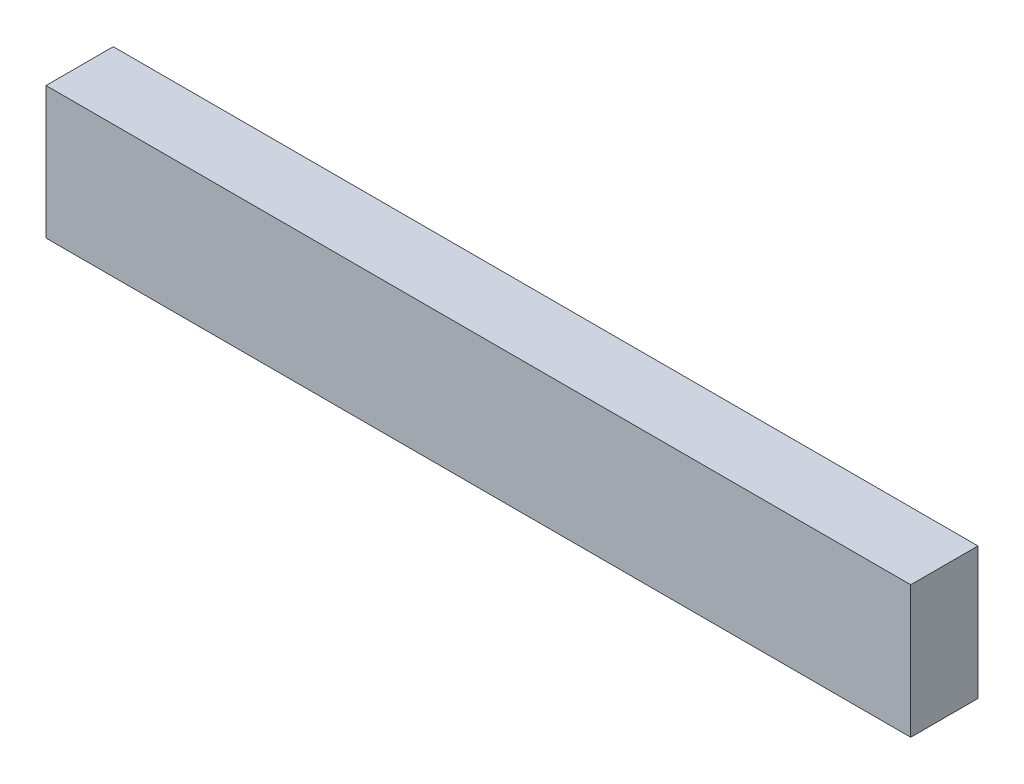
ISO-10303-21;
HEADER;
FILE_DESCRIPTION(('STEP AP214'),'2;1');
FILE_NAME('part.step','',(''),(''),'','','');
FILE_SCHEMA(('AUTOMOTIVE_DESIGN { 1 0 10303 214 1 1 1 1 }'));
ENDSEC;
DATA;
#1=APPLICATION_CONTEXT('core data for automotive mechanical design processes');
#2=APPLICATION_PROTOCOL_DEFINITION('international standard','automotive_design',2000,#1);
#3=PRODUCT_CONTEXT('',#1,'mechanical');
#4=PRODUCT('Part','Part','',(#3));
#5=PRODUCT_RELATED_PRODUCT_CATEGORY('part','',(#4));
#6=PRODUCT_DEFINITION_FORMATION('','',#4);
#7=PRODUCT_DEFINITION_CONTEXT('part definition',#1,'design');
#8=PRODUCT_DEFINITION('design','',#6,#7);
#9=PRODUCT_DEFINITION_SHAPE('','',#8);
#10=(LENGTH_UNIT() NAMED_UNIT(*) SI_UNIT(.MILLI.,.METRE.));
#11=(NAMED_UNIT(*) PLANE_ANGLE_UNIT() SI_UNIT($,.RADIAN.));
#12=(NAMED_UNIT(*) SI_UNIT($,.STERADIAN.) SOLID_ANGLE_UNIT());
#13=UNCERTAINTY_MEASURE_WITH_UNIT(LENGTH_MEASURE(1.E-05),#10,'distance_accuracy_value','');
#14=(GEOMETRIC_REPRESENTATION_CONTEXT(3) GLOBAL_UNCERTAINTY_ASSIGNED_CONTEXT((#13)) GLOBAL_UNIT_ASSIGNED_CONTEXT((#10,
#11,#12)) REPRESENTATION_CONTEXT('',''));
#15=CARTESIAN_POINT('',(0.,0.,0.));
#16=DIRECTION('',(0.,0.,1.));
#17=DIRECTION('',(1.,0.,0.));
#18=AXIS2_PLACEMENT_3D('',#15,#16,#17);
#19=CARTESIAN_POINT('',(180.,-27.5,28.));
#20=DIRECTION('',(-1.,0.,0.));
#21=DIRECTION('',(0.,0.,1.));
#22=AXIS2_PLACEMENT_3D('',#19,#20,#21);
#23=PLANE('',#22);
#24=DIRECTION('',(0.,1.,0.));
#25=VECTOR('',#24,1.);
#26=CARTESIAN_POINT('',(180.,-27.5,0.));
#27=LINE('',#26,#25);
#28=CARTESIAN_POINT('',(180.,-27.5,0.));
#29=VERTEX_POINT('',#28);
#30=CARTESIAN_POINT('',(180.,27.5,0.));
#31=VERTEX_POINT('',#30);
#32=EDGE_CURVE('E113',#29,#31,#27,.T.);
#33=ORIENTED_EDGE('',*,*,#32,.T.);
#34=DIRECTION('',(0.,0.,-1.));
#35=VECTOR('',#34,1.);
#36=CARTESIAN_POINT('',(180.,27.5,28.));
#37=LINE('',#36,#35);
#38=CARTESIAN_POINT('',(180.,27.5,28.));
#39=VERTEX_POINT('',#38);
#40=EDGE_CURVE('E11',#39,#31,#37,.T.);
#41=ORIENTED_EDGE('',*,*,#40,.F.);
#42=DIRECTION('',(0.,1.,0.));
#43=VECTOR('',#42,1.);
#44=CARTESIAN_POINT('',(180.,-27.5,28.));
#45=LINE('',#44,#43);
#46=CARTESIAN_POINT('',(180.,-27.5,28.));
#47=VERTEX_POINT('',#46);
#48=EDGE_CURVE('E97',#47,#39,#45,.T.);
#49=ORIENTED_EDGE('',*,*,#48,.F.);
#50=DIRECTION('',(0.,0.,-1.));
#51=VECTOR('',#50,1.);
#52=CARTESIAN_POINT('',(180.,-27.5,28.));
#53=LINE('',#52,#51);
#54=EDGE_CURVE('E109',#47,#29,#53,.T.);
#55=ORIENTED_EDGE('',*,*,#54,.T.);
#56=EDGE_LOOP('',(#33,#41,#49,#55));
#57=FACE_BOUND('',#56,.T.);
#58=ADVANCED_FACE('F45',(#57),#23,.F.);
#59=CARTESIAN_POINT('',(-180.,27.5,28.));
#60=DIRECTION('',(0.,-1.,0.));
#61=DIRECTION('',(0.,0.,-1.));
#62=AXIS2_PLACEMENT_3D('',#59,#60,#61);
#63=PLANE('',#62);
#64=DIRECTION('',(-1.,0.,0.));
#65=VECTOR('',#64,1.);
#66=CARTESIAN_POINT('',(-180.,27.5,0.));
#67=LINE('',#66,#65);
#68=CARTESIAN_POINT('',(-180.,27.5,0.));
#69=VERTEX_POINT('',#68);
#70=EDGE_CURVE('E102',#31,#69,#67,.T.);
#71=ORIENTED_EDGE('',*,*,#70,.T.);
#72=DIRECTION('',(0.,0.,-1.));
#73=VECTOR('',#72,1.);
#74=CARTESIAN_POINT('',(-180.,27.5,28.));
#75=LINE('',#74,#73);
#76=CARTESIAN_POINT('',(-180.,27.5,28.));
#77=VERTEX_POINT('',#76);
#78=EDGE_CURVE('E54',#77,#69,#75,.T.);
#79=ORIENTED_EDGE('',*,*,#78,.F.);
#80=DIRECTION('',(-1.,0.,0.));
#81=VECTOR('',#80,1.);
#82=CARTESIAN_POINT('',(-180.,27.5,28.));
#83=LINE('',#82,#81);
#84=EDGE_CURVE('E92',#39,#77,#83,.T.);
#85=ORIENTED_EDGE('',*,*,#84,.F.);
#86=ORIENTED_EDGE('',*,*,#40,.T.);
#87=EDGE_LOOP('',(#71,#79,#85,#86));
#88=FACE_BOUND('',#87,.T.);
#89=ADVANCED_FACE('F101',(#88),#63,.F.);
#90=CARTESIAN_POINT('',(-180.,-27.5,28.));
#91=DIRECTION('',(1.,0.,0.));
#92=DIRECTION('',(0.,0.,-1.));
#93=AXIS2_PLACEMENT_3D('',#90,#91,#92);
#94=PLANE('',#93);
#95=DIRECTION('',(0.,-1.,0.));
#96=VECTOR('',#95,1.);
#97=CARTESIAN_POINT('',(-180.,-27.5,0.));
#98=LINE('',#97,#96);
#99=CARTESIAN_POINT('',(-180.,-27.5,0.));
#100=VERTEX_POINT('',#99);
#101=EDGE_CURVE('E79',#69,#100,#98,.T.);
#102=ORIENTED_EDGE('',*,*,#101,.T.);
#103=DIRECTION('',(0.,0.,-1.));
#104=VECTOR('',#103,1.);
#105=CARTESIAN_POINT('',(-180.,-27.5,28.));
#106=LINE('',#105,#104);
#107=CARTESIAN_POINT('',(-180.,-27.5,28.));
#108=VERTEX_POINT('',#107);
#109=EDGE_CURVE('E104',#108,#100,#106,.T.);
#110=ORIENTED_EDGE('',*,*,#109,.F.);
#111=DIRECTION('',(0.,-1.,0.));
#112=VECTOR('',#111,1.);
#113=CARTESIAN_POINT('',(-180.,-27.5,28.));
#114=LINE('',#113,#112);
#115=EDGE_CURVE('E95',#77,#108,#114,.T.);
#116=ORIENTED_EDGE('',*,*,#115,.F.);
#117=ORIENTED_EDGE('',*,*,#78,.T.);
#118=EDGE_LOOP('',(#102,#110,#116,#117));
#119=FACE_BOUND('',#118,.T.);
#120=ADVANCED_FACE('F105',(#119),#94,.F.);
#121=CARTESIAN_POINT('',(-180.,-27.5,28.));
#122=DIRECTION('',(0.,1.,0.));
#123=DIRECTION('',(0.,0.,1.));
#124=AXIS2_PLACEMENT_3D('',#121,#122,#123);
#125=PLANE('',#124);
#126=DIRECTION('',(1.,0.,0.));
#127=VECTOR('',#126,1.);
#128=CARTESIAN_POINT('',(-180.,-27.5,0.));
#129=LINE('',#128,#127);
#130=EDGE_CURVE('E85',#100,#29,#129,.T.);
#131=ORIENTED_EDGE('',*,*,#130,.T.);
#132=ORIENTED_EDGE('',*,*,#54,.F.);
#133=DIRECTION('',(1.,0.,0.));
#134=VECTOR('',#133,1.);
#135=CARTESIAN_POINT('',(-180.,-27.5,28.));
#136=LINE('',#135,#134);
#137=EDGE_CURVE('E62',#108,#47,#136,.T.);
#138=ORIENTED_EDGE('',*,*,#137,.F.);
#139=ORIENTED_EDGE('',*,*,#109,.T.);
#140=EDGE_LOOP('',(#131,#132,#138,#139));
#141=FACE_BOUND('',#140,.T.);
#142=ADVANCED_FACE('F126',(#141),#125,.F.);
#143=CARTESIAN_POINT('',(0.,0.,28.));
#144=DIRECTION('',(0.,0.,-1.));
#145=DIRECTION('',(-1.,0.,0.));
#146=AXIS2_PLACEMENT_3D('',#143,#144,#145);
#147=PLANE('',#146);
#148=ORIENTED_EDGE('',*,*,#48,.T.);
#149=ORIENTED_EDGE('',*,*,#84,.T.);
#150=ORIENTED_EDGE('',*,*,#115,.T.);
#151=ORIENTED_EDGE('',*,*,#137,.T.);
#152=EDGE_LOOP('',(#148,#149,#150,#151));
#153=FACE_BOUND('',#152,.T.);
#154=ADVANCED_FACE('F93',(#153),#147,.F.);
#155=CARTESIAN_POINT('',(0.,0.,0.));
#156=DIRECTION('',(0.,0.,-1.));
#157=DIRECTION('',(-1.,0.,0.));
#158=AXIS2_PLACEMENT_3D('',#155,#156,#157);
#159=PLANE('',#158);
#160=ORIENTED_EDGE('',*,*,#32,.F.);
#161=ORIENTED_EDGE('',*,*,#130,.F.);
#162=ORIENTED_EDGE('',*,*,#101,.F.);
#163=ORIENTED_EDGE('',*,*,#70,.F.);
#164=EDGE_LOOP('',(#160,#161,#162,#163));
#165=FACE_BOUND('',#164,.T.);
#166=ADVANCED_FACE('F129',(#165),#159,.T.);
#167=CLOSED_SHELL('',(#58,#89,#120,#142,#154,#166));
#168=MANIFOLD_SOLID_BREP('B2',#167);
#169=ADVANCED_BREP_SHAPE_REPRESENTATION('',(#18,#168),#14);
#170=SHAPE_DEFINITION_REPRESENTATION(#9,#169);
ENDSEC;
END-ISO-10303-21;
